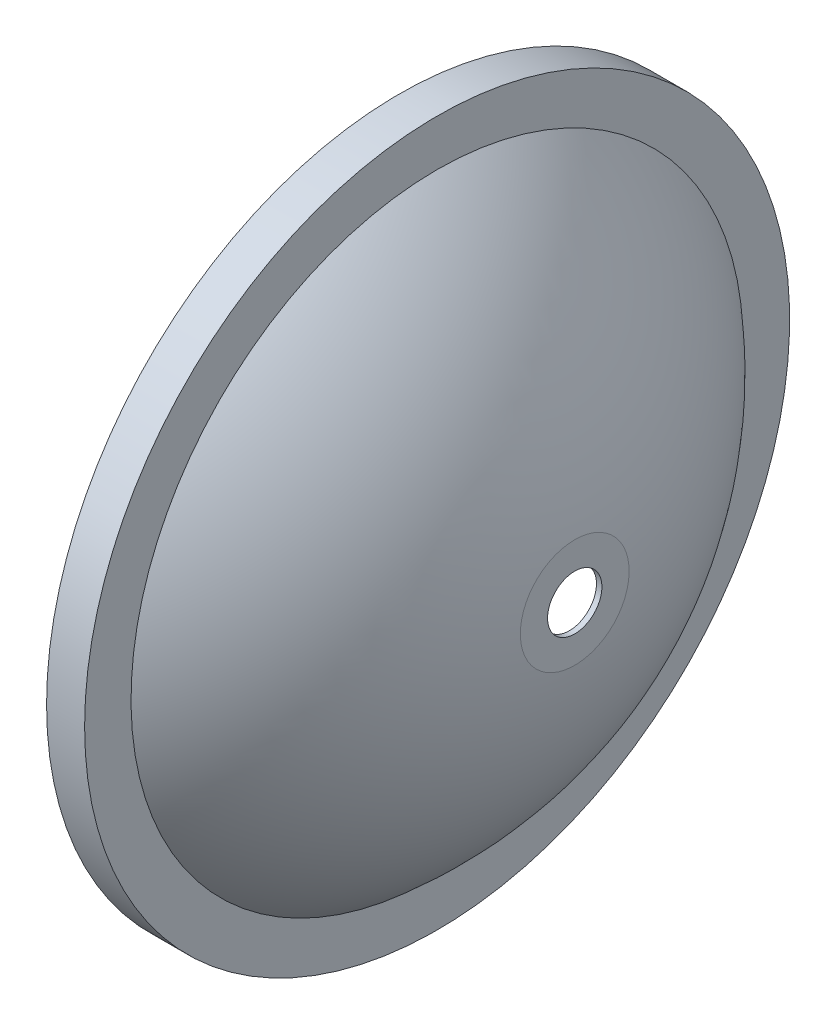
ISO-10303-21;
HEADER;
FILE_DESCRIPTION(('STEP AP214'),'2;1');
FILE_NAME('part.step','',(''),(''),'','','');
FILE_SCHEMA(('AUTOMOTIVE_DESIGN { 1 0 10303 214 1 1 1 1 }'));
ENDSEC;
DATA;
#1=APPLICATION_CONTEXT('core data for automotive mechanical design processes');
#2=APPLICATION_PROTOCOL_DEFINITION('international standard','automotive_design',2000,#1);
#3=PRODUCT_CONTEXT('',#1,'mechanical');
#4=PRODUCT('Part','Part','',(#3));
#5=PRODUCT_RELATED_PRODUCT_CATEGORY('part','',(#4));
#6=PRODUCT_DEFINITION_FORMATION('','',#4);
#7=PRODUCT_DEFINITION_CONTEXT('part definition',#1,'design');
#8=PRODUCT_DEFINITION('design','',#6,#7);
#9=PRODUCT_DEFINITION_SHAPE('','',#8);
#10=(LENGTH_UNIT() NAMED_UNIT(*) SI_UNIT(.MILLI.,.METRE.));
#11=(NAMED_UNIT(*) PLANE_ANGLE_UNIT() SI_UNIT($,.RADIAN.));
#12=(NAMED_UNIT(*) SI_UNIT($,.STERADIAN.) SOLID_ANGLE_UNIT());
#13=UNCERTAINTY_MEASURE_WITH_UNIT(LENGTH_MEASURE(1.E-05),#10,'distance_accuracy_value','');
#14=(GEOMETRIC_REPRESENTATION_CONTEXT(3) GLOBAL_UNCERTAINTY_ASSIGNED_CONTEXT((#13)) GLOBAL_UNIT_ASSIGNED_CONTEXT((#10,
#11,#12)) REPRESENTATION_CONTEXT('',''));
#15=CARTESIAN_POINT('',(0.,0.,0.));
#16=DIRECTION('',(0.,0.,1.));
#17=DIRECTION('',(1.,0.,0.));
#18=AXIS2_PLACEMENT_3D('',#15,#16,#17);
#19=CARTESIAN_POINT('',(-31.3199350828015,64.8569601750758,0.));
#20=DIRECTION('',(1.,0.,0.));
#21=DIRECTION('',(0.,0.,-1.));
#22=AXIS2_PLACEMENT_3D('',#19,#20,#21);
#23=PLANE('',#22);
#24=CARTESIAN_POINT('',(-31.3199350828015,0.,0.));
#25=DIRECTION('',(-1.,0.,0.));
#26=DIRECTION('',(0.,0.,1.));
#27=AXIS2_PLACEMENT_3D('',#24,#25,#26);
#28=CIRCLE('',#27,63.8569601750758);
#29=CARTESIAN_POINT('',(-31.3199350828015,0.,63.8569601750758));
#30=VERTEX_POINT('',#29);
#31=EDGE_CURVE('E67',#30,#30,#28,.T.);
#32=ORIENTED_EDGE('',*,*,#31,.F.);
#33=EDGE_LOOP('',(#32));
#34=FACE_BOUND('',#33,.T.);
#35=CARTESIAN_POINT('',(-31.3199350828015,0.,0.));
#36=DIRECTION('',(-1.,0.,0.));
#37=DIRECTION('',(0.,0.,1.));
#38=AXIS2_PLACEMENT_3D('',#35,#36,#37);
#39=CIRCLE('',#38,64.8569601750758);
#40=CARTESIAN_POINT('',(-31.3199350828015,0.,64.8569601750758));
#41=VERTEX_POINT('',#40);
#42=EDGE_CURVE('E10',#41,#41,#39,.T.);
#43=ORIENTED_EDGE('',*,*,#42,.T.);
#44=EDGE_LOOP('',(#43));
#45=FACE_BOUND('',#44,.T.);
#46=ADVANCED_FACE('F33',(#34,#45),#23,.F.);
#47=CARTESIAN_POINT('',(-67.855420072357,0.,0.));
#48=DIRECTION('',(-1.,0.,0.));
#49=DIRECTION('',(0.,0.,1.));
#50=AXIS2_PLACEMENT_3D('',#47,#48,#49);
#51=CYLINDRICAL_SURFACE('',#50,64.8569601750758);
#52=ORIENTED_EDGE('',*,*,#42,.F.);
#53=EDGE_LOOP('',(#52));
#54=FACE_BOUND('',#53,.T.);
#55=CARTESIAN_POINT('',(-24.3199350828015,0.,0.));
#56=DIRECTION('',(-1.,0.,0.));
#57=DIRECTION('',(0.,0.,1.));
#58=AXIS2_PLACEMENT_3D('',#55,#56,#57);
#59=CIRCLE('',#58,64.8569601750758);
#60=CARTESIAN_POINT('',(-24.3199350828015,0.,64.8569601750758));
#61=VERTEX_POINT('',#60);
#62=EDGE_CURVE('E39',#61,#61,#59,.T.);
#63=ORIENTED_EDGE('',*,*,#62,.T.);
#64=EDGE_LOOP('',(#63));
#65=FACE_BOUND('',#64,.T.);
#66=ADVANCED_FACE('F74',(#54,#65),#51,.T.);
#67=CARTESIAN_POINT('',(-24.3199350828015,56.3205113613149,0.));
#68=DIRECTION('',(-1.,0.,0.));
#69=DIRECTION('',(0.,0.,1.));
#70=AXIS2_PLACEMENT_3D('',#67,#68,#69);
#71=PLANE('',#70);
#72=ORIENTED_EDGE('',*,*,#62,.F.);
#73=EDGE_LOOP('',(#72));
#74=FACE_BOUND('',#73,.T.);
#75=CARTESIAN_POINT('',(-24.3199350828015,0.,0.));
#76=DIRECTION('',(-1.,0.,0.));
#77=DIRECTION('',(0.,0.,1.));
#78=AXIS2_PLACEMENT_3D('',#75,#76,#77);
#79=CIRCLE('',#78,56.3205113613149);
#80=CARTESIAN_POINT('',(-24.3199350828015,56.3205113613149,0.));
#81=VERTEX_POINT('',#80);
#82=EDGE_CURVE('E43',#81,#81,#79,.T.);
#83=ORIENTED_EDGE('',*,*,#82,.T.);
#84=EDGE_LOOP('',(#83));
#85=FACE_BOUND('',#84,.T.);
#86=ADVANCED_FACE('F78',(#74,#85),#71,.F.);
#87=CARTESIAN_POINT('',(-72.3199350828015,0.,0.));
#88=DIRECTION('',(-1.,0.,0.));
#89=DIRECTION('',(0.,1.,0.));
#90=AXIS2_PLACEMENT_3D('',#87,#88,#89);
#91=SPHERICAL_SURFACE('',#90,74.);
#92=CARTESIAN_POINT('',(1.,0.,0.));
#93=DIRECTION('',(-1.,0.,0.));
#94=DIRECTION('',(0.,0.,1.));
#95=AXIS2_PLACEMENT_3D('',#92,#93,#94);
#96=CIRCLE('',#95,10.0093516000675);
#97=CARTESIAN_POINT('',(1.00000000000001,10.0093516000675,0.));
#98=VERTEX_POINT('',#97);
#99=EDGE_CURVE('E47',#98,#98,#96,.T.);
#100=CARTESIAN_POINT('',(-24.3199350828015,56.3205113613149,0.));
#101=CARTESIAN_POINT('',(-23.8920677166568,55.9558565548965,0.));
#102=CARTESIAN_POINT('',(-23.4683573390895,55.5863242436467,0.));
#103=CARTESIAN_POINT('',(-22.6294671444821,54.8377004647492,0.));
#104=CARTESIAN_POINT('',(-22.2142873274421,54.4586089971016,0.));
#105=CARTESIAN_POINT('',(-21.3926748372619,53.6910627586734,0.));
#106=CARTESIAN_POINT('',(-20.9862421641218,53.3026079878929,0.));
#107=CARTESIAN_POINT('',(-20.1823348145556,52.5165371902141,0.));
#108=CARTESIAN_POINT('',(-19.7848601381296,52.1189211633157,0.));
#109=CARTESIAN_POINT('',(-18.9990753000844,51.3147343023534,0.));
#110=CARTESIAN_POINT('',(-18.6107651384653,50.9081634682895,0.));
#111=CARTESIAN_POINT('',(-17.8435110027801,50.0862781886497,0.));
#112=CARTESIAN_POINT('',(-17.4645670287141,49.6709637430738,0.));
#113=CARTESIAN_POINT('',(-16.7162420988639,48.8318069519572,0.));
#114=CARTESIAN_POINT('',(-16.3468611430797,48.4079646064164,0.));
#115=CARTESIAN_POINT('',(-15.6178541073097,47.55197216322,0.));
#116=CARTESIAN_POINT('',(-15.2582280273239,47.1198220655644,0.));
#117=CARTESIAN_POINT('',(-14.5489175355629,46.2474385792502,0.));
#118=CARTESIAN_POINT('',(-14.1992331237876,45.8072051905915,0.));
#119=CARTESIAN_POINT('',(-13.5099875966547,44.9188837823878,0.));
#120=CARTESIAN_POINT('',(-13.1704264812972,44.4707957628427,0.));
#121=CARTESIAN_POINT('',(-12.5016039172203,43.566997832596,0.));
#122=CARTESIAN_POINT('',(-12.172342468501,43.1112879218943,0.));
#123=CARTESIAN_POINT('',(-11.5242902581776,42.192482907958,0.));
#124=CARTESIAN_POINT('',(-11.2054994965735,41.7293878047235,0.));
#125=CARTESIAN_POINT('',(-10.5785542424247,40.7960529402516,0.));
#126=CARTESIAN_POINT('',(-10.2703997498799,40.3258131790142,0.));
#127=CARTESIAN_POINT('',(-9.66488709124596,39.37843324405,0.));
#128=CARTESIAN_POINT('',(-9.36752892515678,38.9012930703231,0.));
#129=CARTESIAN_POINT('',(-8.78376336915048,37.9403601400104,0.));
#130=CARTESIAN_POINT('',(-8.49735597923336,37.4565673834245,0.));
#131=CARTESIAN_POINT('',(-7.93564073738496,36.4825805724184,0.));
#132=CARTESIAN_POINT('',(-7.66033288545367,35.992386517998,0.));
#133=CARTESIAN_POINT('',(-7.12095971622035,35.005851721222,0.));
#134=CARTESIAN_POINT('',(-6.85689439891831,34.5095109788663,0.));
#135=CARTESIAN_POINT('',(-6.34014345614315,33.5109406087472,0.));
#136=CARTESIAN_POINT('',(-6.08745783067002,33.0087109809838,0.));
#137=CARTESIAN_POINT('',(-5.59359751806829,31.9986237013017,0.));
#138=CARTESIAN_POINT('',(-5.35242283093969,31.4907660493829,0.));
#139=CARTESIAN_POINT('',(-4.88170966268809,30.4696865058735,0.));
#140=CARTESIAN_POINT('',(-4.65217118156509,29.9564646142829,0.));
#141=CARTESIAN_POINT('',(-4.20484964906747,28.9249231621335,0.));
#142=CARTESIAN_POINT('',(-3.98706659769286,28.4066036015746,0.));
#143=CARTESIAN_POINT('',(-3.56336904258674,27.3651360299544,0.));
#144=CARTESIAN_POINT('',(-3.35745453885524,26.8419880188931,0.));
#145=CARTESIAN_POINT('',(-2.95760103234372,25.7911352726593,0.));
#146=CARTESIAN_POINT('',(-2.7636620295637,25.2634305374868,0.));
#147=CARTESIAN_POINT('',(-2.38786025806561,24.2037384362213,0.));
#148=CARTESIAN_POINT('',(-2.20599748934754,23.6717510701282,0.));
#149=CARTESIAN_POINT('',(-1.85444264678595,22.6037700246093,0.));
#150=CARTESIAN_POINT('',(-1.68475057294242,22.0677763451836,0.));
#151=CARTESIAN_POINT('',(-1.35762525875475,20.9920610715963,0.));
#152=CARTESIAN_POINT('',(-1.2001920184106,20.4523394774347,0.));
#153=CARTESIAN_POINT('',(-0.897666144962722,19.3694487088863,0.));
#154=CARTESIAN_POINT('',(-0.752573511858985,18.8262795344996,0.));
#155=CARTESIAN_POINT('',(-0.474804207766986,17.7367757321571,0.));
#156=CARTESIAN_POINT('',(-0.342127536778724,17.1904411042013,0.));
#157=CARTESIAN_POINT('',(-0.0892590967366873,16.0948901601203,0.));
#158=CARTESIAN_POINT('',(0.0309326723170865,15.5456738439951,0.));
#159=CARTESIAN_POINT('',(0.258768979825561,14.4446448059444,0.));
#160=CARTESIAN_POINT('',(0.366413518280262,13.8928320840189,0.));
#161=CARTESIAN_POINT('',(0.569099081241558,12.7868967899296,0.));
#162=CARTESIAN_POINT('',(0.664140105748154,12.2327742177658,0.));
#163=CARTESIAN_POINT('',(0.841570664574202,11.1225072598977,0.));
#164=CARTESIAN_POINT('',(0.923960198893654,10.5663628741933,0.));
#165=CARTESIAN_POINT('',(1.00000000000001,10.0093516000675,0.));
#166=B_SPLINE_CURVE_WITH_KNOTS('',3,(#100,#101,#102,#103,#104,#105,#106,#107,#108,#109,#110,
#111,#112,#113,#114,#115,#116,#117,#118,#119,#120,#121,#122,#123,#124,#125,#126,#127,#128,#129,
#130,#131,#132,#133,#134,#135,#136,#137,#138,#139,#140,#141,#142,#143,#144,#145,#146,#147,#148,
#149,#150,#151,#152,#153,#154,#155,#156,#157,#158,#159,#160,#161,#162,#163,#164,#165),
.UNSPECIFIED.,.F.,.F.,(4,2,2,2,2,2,2,2,2,2,2,2,2,2,2,2,2,2,2,2,2,2,2,2,2,2,2,2,2,2,2,2,4),(0.,
1.68649610469834,3.37299220939668,5.05948831409502,6.74598441879336,8.4324805234917,
10.11897662819,11.8054727328884,13.4919688375867,15.1784649422851,16.8649610469834,
18.5514571516817,20.2379532563801,21.9244493610784,23.6109454657768,25.2974415704751,
26.9839376751734,28.6704337798718,30.3569298845701,32.0434259892684,33.7299220939668,
35.4164181986651,37.1029143033635,38.7894104080618,40.4759065127602,42.1624026174585,
43.8488987221568,45.5353948268552,47.2218909315535,48.9083870362519,50.5948831409502,
52.2813792456485,53.9678753503469),.UNSPECIFIED.);
#167=EDGE_CURVE('BSEAM83',#81,#98,#166,.T.);
#168=ORIENTED_EDGE('',*,*,#82,.F.);
#169=ORIENTED_EDGE('',*,*,#99,.T.);
#170=ORIENTED_EDGE('',*,*,#167,.T.);
#171=ORIENTED_EDGE('',*,*,#167,.F.);
#172=EDGE_LOOP('',(#168,#170,#169,#171));
#173=FACE_BOUND('',#172,.T.);
#174=ADVANCED_FACE('F83',(#173),#91,.T.);
#175=CARTESIAN_POINT('',(1.,5.,0.));
#176=DIRECTION('',(-1.,0.,0.));
#177=DIRECTION('',(0.,0.,1.));
#178=AXIS2_PLACEMENT_3D('',#175,#176,#177);
#179=PLANE('',#178);
#180=ORIENTED_EDGE('',*,*,#99,.F.);
#181=EDGE_LOOP('',(#180));
#182=FACE_BOUND('',#181,.T.);
#183=CARTESIAN_POINT('',(1.,0.,0.));
#184=DIRECTION('',(-1.,0.,0.));
#185=DIRECTION('',(0.,0.,1.));
#186=AXIS2_PLACEMENT_3D('',#183,#184,#185);
#187=CIRCLE('',#186,5.);
#188=CARTESIAN_POINT('',(1.,0.,5.));
#189=VERTEX_POINT('',#188);
#190=EDGE_CURVE('E52',#189,#189,#187,.T.);
#191=ORIENTED_EDGE('',*,*,#190,.T.);
#192=EDGE_LOOP('',(#191));
#193=FACE_BOUND('',#192,.T.);
#194=ADVANCED_FACE('F89',(#182,#193),#179,.F.);
#195=CARTESIAN_POINT('',(-67.855420072357,0.,0.));
#196=DIRECTION('',(-1.,0.,0.));
#197=DIRECTION('',(0.,0.,1.));
#198=AXIS2_PLACEMENT_3D('',#195,#196,#197);
#199=CYLINDRICAL_SURFACE('',#198,5.);
#200=ORIENTED_EDGE('',*,*,#190,.F.);
#201=EDGE_LOOP('',(#200));
#202=FACE_BOUND('',#201,.T.);
#203=CARTESIAN_POINT('',(0.,0.,0.));
#204=DIRECTION('',(-1.,0.,0.));
#205=DIRECTION('',(0.,0.,1.));
#206=AXIS2_PLACEMENT_3D('',#203,#204,#205);
#207=CIRCLE('',#206,5.);
#208=CARTESIAN_POINT('',(0.,0.,5.));
#209=VERTEX_POINT('',#208);
#210=EDGE_CURVE('E55',#209,#209,#207,.T.);
#211=ORIENTED_EDGE('',*,*,#210,.T.);
#212=EDGE_LOOP('',(#211));
#213=FACE_BOUND('',#212,.T.);
#214=ADVANCED_FACE('F93',(#202,#213),#199,.F.);
#215=CARTESIAN_POINT('',(0.,5.,0.));
#216=DIRECTION('',(1.,0.,0.));
#217=DIRECTION('',(0.,0.,-1.));
#218=AXIS2_PLACEMENT_3D('',#215,#216,#217);
#219=PLANE('',#218);
#220=ORIENTED_EDGE('',*,*,#210,.F.);
#221=EDGE_LOOP('',(#220));
#222=FACE_BOUND('',#221,.T.);
#223=CARTESIAN_POINT('',(0.,0.,0.));
#224=DIRECTION('',(-1.,0.,0.));
#225=DIRECTION('',(0.,0.,1.));
#226=AXIS2_PLACEMENT_3D('',#223,#224,#225);
#227=CIRCLE('',#226,9.94117647058823);
#228=CARTESIAN_POINT('',(0.,9.9411764705882,0.));
#229=VERTEX_POINT('',#228);
#230=EDGE_CURVE('E58',#229,#229,#227,.T.);
#231=ORIENTED_EDGE('',*,*,#230,.T.);
#232=EDGE_LOOP('',(#231));
#233=FACE_BOUND('',#232,.T.);
#234=ADVANCED_FACE('F97',(#222,#233),#219,.F.);
#235=CARTESIAN_POINT('',(-72.3199350828015,0.,0.));
#236=DIRECTION('',(-1.,0.,0.));
#237=DIRECTION('',(0.,1.,0.));
#238=AXIS2_PLACEMENT_3D('',#235,#236,#237);
#239=SPHERICAL_SURFACE('',#238,73.);
#240=CARTESIAN_POINT('',(-25.3199350828015,0.,0.));
#241=DIRECTION('',(-1.,0.,0.));
#242=DIRECTION('',(0.,0.,1.));
#243=AXIS2_PLACEMENT_3D('',#240,#241,#242);
#244=CIRCLE('',#243,55.8569601750758);
#245=CARTESIAN_POINT('',(-25.3199350828015,55.8569601750758,0.));
#246=VERTEX_POINT('',#245);
#247=EDGE_CURVE('E61',#246,#246,#244,.T.);
#248=CARTESIAN_POINT('',(0.,9.9411764705882,0.));
#249=CARTESIAN_POINT('',(-0.07607891456859,10.4946432337162,0.));
#250=CARTESIAN_POINT('',(-0.158513727964569,11.0472362593925,0.));
#251=CARTESIAN_POINT('',(-0.336046437162319,12.1503844131389,0.));
#252=CARTESIAN_POINT('',(-0.43114433296409,12.700939541209,0.));
#253=CARTESIAN_POINT('',(-0.633954491724493,13.7997214770402,0.));
#254=CARTESIAN_POINT('',(-0.741666754683126,14.3479482848014,0.));
#255=CARTESIAN_POINT('',(-0.969648495047407,15.4417846723844,0.));
#256=CARTESIAN_POINT('',(-1.08991797245306,15.9873942522062,0.));
#257=CARTESIAN_POINT('',(-1.34295084935673,17.0757085786899,0.));
#258=CARTESIAN_POINT('',(-1.47571424885476,17.6184133253518,0.));
#259=CARTESIAN_POINT('',(-1.75366496367893,18.7006319320873,0.));
#260=CARTESIAN_POINT('',(-1.89885227900507,19.2401457921611,0.));
#261=CARTESIAN_POINT('',(-2.20157430502458,20.3156982486602,0.));
#262=CARTESIAN_POINT('',(-2.35910901571794,20.8517368450856,0.));
#263=CARTESIAN_POINT('',(-2.68644279452241,21.9200562305112,0.));
#264=CARTESIAN_POINT('',(-2.85624186263352,22.4523370195114,0.));
#265=CARTESIAN_POINT('',(-3.20801485629387,23.5128602266393,0.));
#266=CARTESIAN_POINT('',(-3.38998878184311,24.0411026447671,0.));
#267=CARTESIAN_POINT('',(-3.766015572413,25.0932706754207,0.));
#268=CARTESIAN_POINT('',(-3.96006843743365,25.6171962879465,0.));
#269=CARTESIAN_POINT('',(-4.3601508223897,26.6604545480118,0.));
#270=CARTESIAN_POINT('',(-4.56618034232511,27.1797871955512,0.));
#271=CARTESIAN_POINT('',(-4.99010743965317,28.2135857872026,0.));
#272=CARTESIAN_POINT('',(-5.20800501704583,28.7280517313146,0.));
#273=CARTESIAN_POINT('',(-5.65555337623152,29.7518457428905,0.));
#274=CARTESIAN_POINT('',(-5.88520415802456,30.2611738103545,0.));
#275=CARTESIAN_POINT('',(-6.35613787787738,31.2744236035715,0.));
#276=CARTESIAN_POINT('',(-6.59742081593716,31.7783453293245,0.));
#277=CARTESIAN_POINT('',(-7.09149166892138,32.7805168237206,0.));
#278=CARTESIAN_POINT('',(-7.34427958384582,33.2787665923637,0.));
#279=CARTESIAN_POINT('',(-7.86122714692352,34.2693315468098,0.));
#280=CARTESIAN_POINT('',(-8.12538679507678,34.7616467326128,0.));
#281=CARTESIAN_POINT('',(-8.66493858697505,35.7400830237468,0.));
#282=CARTESIAN_POINT('',(-8.94033073072007,36.2262041290778,0.));
#283=CARTESIAN_POINT('',(-9.50220235555524,37.1919960265142,0.));
#284=CARTESIAN_POINT('',(-9.78868183664538,37.6716668186196,0.));
#285=CARTESIAN_POINT('',(-10.372577133827,38.624305256789,0.));
#286=CARTESIAN_POINT('',(-10.6699929499185,39.097272902853,0.));
#287=CARTESIAN_POINT('',(-11.2756041502545,40.0362557493291,0.));
#288=CARTESIAN_POINT('',(-11.5837995344991,40.5022709497411,0.));
#289=CARTESIAN_POINT('',(-12.2108074224204,41.4271032699122,0.));
#290=CARTESIAN_POINT('',(-12.5296199260972,41.8859203896712,0.));
#291=CARTESIAN_POINT('',(-13.177694007913,42.7961147076209,0.));
#292=CARTESIAN_POINT('',(-13.506955586052,43.2474919058116,0.));
#293=CARTESIAN_POINT('',(-14.1757542641598,44.1425684612569,0.));
#294=CARTESIAN_POINT('',(-14.5152913641286,44.5862678185115,0.));
#295=CARTESIAN_POINT('',(-15.2044621170395,45.4657548197161,0.));
#296=CARTESIAN_POINT('',(-15.5540957699817,45.9015424636662,0.));
#297=CARTESIAN_POINT('',(-16.2632753382437,46.7649763359954,0.));
#298=CARTESIAN_POINT('',(-16.6228212535635,47.1926225643745,0.));
#299=CARTESIAN_POINT('',(-17.3516358308227,48.0395481951103,0.));
#300=CARTESIAN_POINT('',(-17.7209044927619,48.4588275974669,0.));
#301=CARTESIAN_POINT('',(-18.46896992433,49.2887985739544,0.));
#302=CARTESIAN_POINT('',(-18.8477666939587,49.6994901480852,0.));
#303=CARTESIAN_POINT('',(-19.6146886735688,50.5120689995372,0.));
#304=CARTESIAN_POINT('',(-20.0028138835501,50.9139562768584,0.));
#305=CARTESIAN_POINT('',(-20.7881881825828,51.7087146806784,0.));
#306=CARTESIAN_POINT('',(-21.1854372716343,52.1015858071773,0.));
#307=CARTESIAN_POINT('',(-21.9888498723611,52.8781049052898,0.));
#308=CARTESIAN_POINT('',(-22.3950133840364,53.2617528769034,0.));
#309=CARTESIAN_POINT('',(-23.2160409957557,54.0196231585481,0.));
#310=CARTESIAN_POINT('',(-23.6309050957996,54.3938454685791,0.));
#311=CARTESIAN_POINT('',(-24.4691142661401,55.1326682475364,0.));
#312=CARTESIAN_POINT('',(-24.8924593364366,55.4972687164628,0.));
#313=CARTESIAN_POINT('',(-25.3199350828015,55.8569601750758,0.));
#314=B_SPLINE_CURVE_WITH_KNOTS('',3,(#248,#249,#250,#251,#252,#253,#254,#255,#256,#257,#258,
#259,#260,#261,#262,#263,#264,#265,#266,#267,#268,#269,#270,#271,#272,#273,#274,#275,#276,#277,
#278,#279,#280,#281,#282,#283,#284,#285,#286,#287,#288,#289,#290,#291,#292,#293,#294,#295,#296,
#297,#298,#299,#300,#301,#302,#303,#304,#305,#306,#307,#308,#309,#310,#311,#312,#313),
.UNSPECIFIED.,.F.,.F.,(4,2,2,2,2,2,2,2,2,2,2,2,2,2,2,2,2,2,2,2,2,2,2,2,2,2,2,2,2,2,2,2,4),(0.,
1.6759765725909,3.35195314518179,5.0279297177727,6.7039062903636,8.37988286295449,
10.0558594355454,11.7318360081363,13.4078125807272,15.0837891533181,16.759765725909,
18.4357422984999,20.1117188710908,21.7876954436817,23.4636720162726,25.1396485888635,
26.8156251614544,28.4916017340453,30.1675783066362,31.8435548792271,33.519531451818,
35.1955080244089,36.8714845969998,38.5474611695907,40.2234377421816,41.8994143147725,
43.5753908873634,45.2513674599542,46.9273440325452,48.603320605136,50.2792971777269,
51.9552737503178,53.6312503229087),.UNSPECIFIED.);
#315=EDGE_CURVE('BSEAM101',#229,#246,#314,.T.);
#316=ORIENTED_EDGE('',*,*,#230,.F.);
#317=ORIENTED_EDGE('',*,*,#247,.T.);
#318=ORIENTED_EDGE('',*,*,#315,.T.);
#319=ORIENTED_EDGE('',*,*,#315,.F.);
#320=EDGE_LOOP('',(#316,#318,#317,#319));
#321=FACE_BOUND('',#320,.T.);
#322=ADVANCED_FACE('F101',(#321),#239,.F.);
#323=CARTESIAN_POINT('',(-25.3199350828015,55.8569601750758,0.));
#324=DIRECTION('',(1.,0.,0.));
#325=DIRECTION('',(0.,0.,-1.));
#326=AXIS2_PLACEMENT_3D('',#323,#324,#325);
#327=PLANE('',#326);
#328=ORIENTED_EDGE('',*,*,#247,.F.);
#329=EDGE_LOOP('',(#328));
#330=FACE_BOUND('',#329,.T.);
#331=CARTESIAN_POINT('',(-25.3199350828015,0.,0.));
#332=DIRECTION('',(-1.,0.,0.));
#333=DIRECTION('',(0.,0.,1.));
#334=AXIS2_PLACEMENT_3D('',#331,#332,#333);
#335=CIRCLE('',#334,63.8569601750758);
#336=CARTESIAN_POINT('',(-25.3199350828015,0.,63.8569601750758));
#337=VERTEX_POINT('',#336);
#338=EDGE_CURVE('E64',#337,#337,#335,.T.);
#339=ORIENTED_EDGE('',*,*,#338,.T.);
#340=EDGE_LOOP('',(#339));
#341=FACE_BOUND('',#340,.T.);
#342=ADVANCED_FACE('F105',(#330,#341),#327,.F.);
#343=CARTESIAN_POINT('',(-67.855420072357,0.,0.));
#344=DIRECTION('',(-1.,0.,0.));
#345=DIRECTION('',(0.,0.,1.));
#346=AXIS2_PLACEMENT_3D('',#343,#344,#345);
#347=CYLINDRICAL_SURFACE('',#346,63.8569601750758);
#348=ORIENTED_EDGE('',*,*,#338,.F.);
#349=EDGE_LOOP('',(#348));
#350=FACE_BOUND('',#349,.T.);
#351=ORIENTED_EDGE('',*,*,#31,.T.);
#352=EDGE_LOOP('',(#351));
#353=FACE_BOUND('',#352,.T.);
#354=ADVANCED_FACE('F71',(#350,#353),#347,.F.);
#355=CLOSED_SHELL('',(#46,#66,#86,#174,#194,#214,#234,#322,#342,#354));
#356=MANIFOLD_SOLID_BREP('B2',#355);
#357=ADVANCED_BREP_SHAPE_REPRESENTATION('',(#18,#356),#14);
#358=SHAPE_DEFINITION_REPRESENTATION(#9,#357);
ENDSEC;
END-ISO-10303-21;
